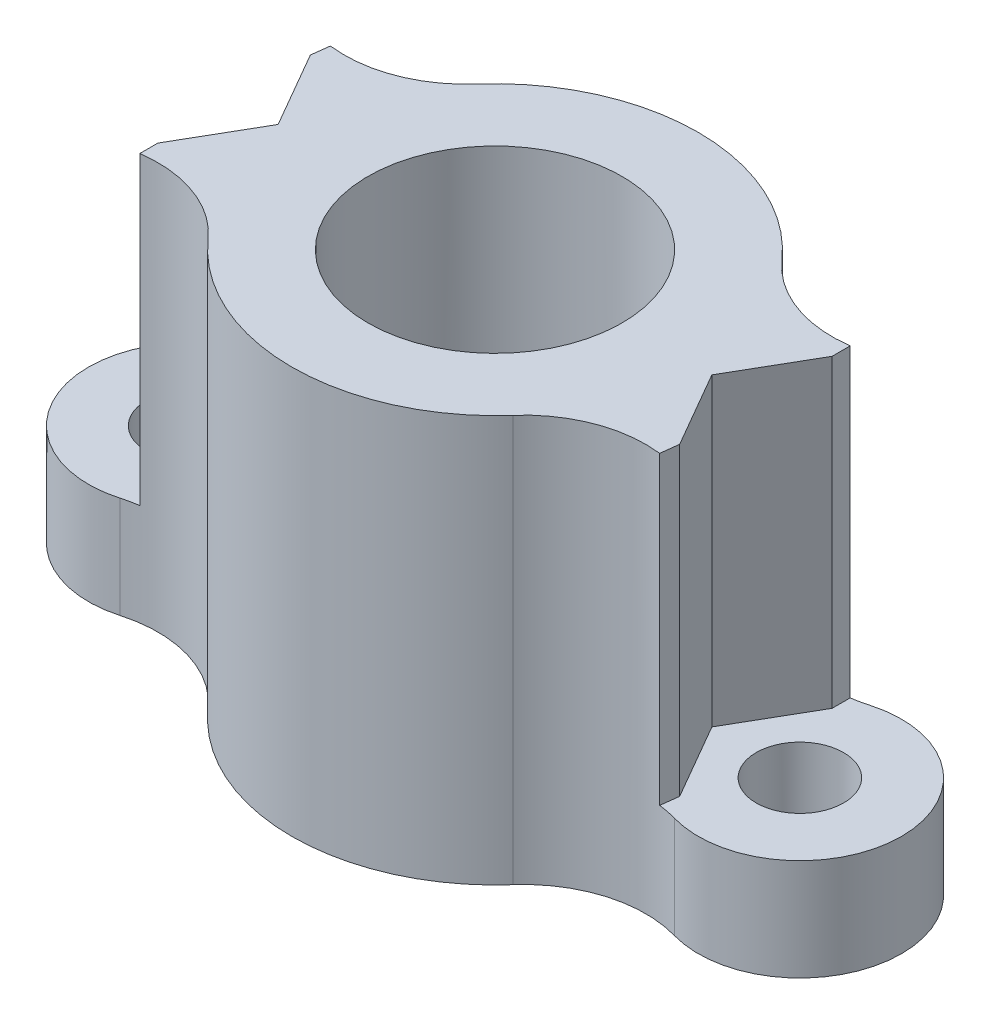
ISO-10303-21;
HEADER;
FILE_DESCRIPTION(('STEP AP214'),'2;1');
FILE_NAME('part.step','',(''),(''),'','','');
FILE_SCHEMA(('AUTOMOTIVE_DESIGN { 1 0 10303 214 1 1 1 1 }'));
ENDSEC;
DATA;
#1=APPLICATION_CONTEXT('core data for automotive mechanical design processes');
#2=APPLICATION_PROTOCOL_DEFINITION('international standard','automotive_design',2000,#1);
#3=PRODUCT_CONTEXT('',#1,'mechanical');
#4=PRODUCT('Part','Part','',(#3));
#5=PRODUCT_RELATED_PRODUCT_CATEGORY('part','',(#4));
#6=PRODUCT_DEFINITION_FORMATION('','',#4);
#7=PRODUCT_DEFINITION_CONTEXT('part definition',#1,'design');
#8=PRODUCT_DEFINITION('design','',#6,#7);
#9=PRODUCT_DEFINITION_SHAPE('','',#8);
#10=(LENGTH_UNIT() NAMED_UNIT(*) SI_UNIT(.MILLI.,.METRE.));
#11=(NAMED_UNIT(*) PLANE_ANGLE_UNIT() SI_UNIT($,.RADIAN.));
#12=(NAMED_UNIT(*) SI_UNIT($,.STERADIAN.) SOLID_ANGLE_UNIT());
#13=UNCERTAINTY_MEASURE_WITH_UNIT(LENGTH_MEASURE(1.E-05),#10,'distance_accuracy_value','');
#14=(GEOMETRIC_REPRESENTATION_CONTEXT(3) GLOBAL_UNCERTAINTY_ASSIGNED_CONTEXT((#13)) GLOBAL_UNIT_ASSIGNED_CONTEXT((#10,
#11,#12)) REPRESENTATION_CONTEXT('',''));
#15=CARTESIAN_POINT('',(0.,0.,0.));
#16=DIRECTION('',(0.,0.,1.));
#17=DIRECTION('',(1.,0.,0.));
#18=AXIS2_PLACEMENT_3D('',#15,#16,#17);
#19=CARTESIAN_POINT('',(0.,0.,0.));
#20=DIRECTION('',(0.,1.,0.));
#21=DIRECTION('',(0.,0.,1.));
#22=AXIS2_PLACEMENT_3D('',#19,#20,#21);
#23=CYLINDRICAL_SURFACE('',#22,2.25);
#24=CARTESIAN_POINT('',(0.,9.,0.));
#25=DIRECTION('',(0.,1.,0.));
#26=DIRECTION('',(0.,0.,1.));
#27=AXIS2_PLACEMENT_3D('',#24,#25,#26);
#28=CIRCLE('',#27,2.25);
#29=CARTESIAN_POINT('',(0.,9.,2.25));
#30=VERTEX_POINT('',#29);
#31=EDGE_CURVE('E209',#30,#30,#28,.T.);
#32=ORIENTED_EDGE('',*,*,#31,.T.);
#33=EDGE_LOOP('',(#32));
#34=FACE_BOUND('',#33,.T.);
#35=CARTESIAN_POINT('',(0.,4.,0.));
#36=DIRECTION('',(0.,-1.,0.));
#37=DIRECTION('',(0.,0.,-1.));
#38=AXIS2_PLACEMENT_3D('',#35,#36,#37);
#39=CIRCLE('',#38,2.25);
#40=CARTESIAN_POINT('',(0.,4.,-2.25));
#41=VERTEX_POINT('',#40);
#42=EDGE_CURVE('E45',#41,#41,#39,.F.);
#43=ORIENTED_EDGE('',*,*,#42,.F.);
#44=EDGE_LOOP('',(#43));
#45=FACE_BOUND('',#44,.T.);
#46=ADVANCED_FACE('F41',(#34,#45),#23,.F.);
#47=CARTESIAN_POINT('',(-12.,20.,10.5830052442584));
#48=DIRECTION('',(0.,-1.,0.));
#49=DIRECTION('',(0.,0.,-1.));
#50=AXIS2_PLACEMENT_3D('',#47,#48,#49);
#51=CYLINDRICAL_SURFACE('',#50,6.);
#52=DIRECTION('',(0.,1.,0.));
#53=VECTOR('',#52,1.);
#54=CARTESIAN_POINT('',(-12.8349364905389,-13.6766688264804,4.64138248134531));
#55=LINE('',#54,#53);
#56=CARTESIAN_POINT('',(-12.8349364905389,5.,4.64138248134531));
#57=VERTEX_POINT('',#56);
#58=CARTESIAN_POINT('',(-12.8349364905389,20.,4.64138248134531));
#59=VERTEX_POINT('',#58);
#60=EDGE_CURVE('E66',#57,#59,#55,.T.);
#61=ORIENTED_EDGE('',*,*,#60,.F.);
#62=CARTESIAN_POINT('',(-12.,5.,10.5830052442584));
#63=DIRECTION('',(0.,-1.,0.));
#64=DIRECTION('',(0.,0.,-1.));
#65=AXIS2_PLACEMENT_3D('',#62,#63,#64);
#66=CIRCLE('',#65,6.);
#67=CARTESIAN_POINT('',(-13.6363636363636,5.,4.81045692920835));
#68=VERTEX_POINT('',#67);
#69=EDGE_CURVE('E187',#68,#57,#66,.T.);
#70=ORIENTED_EDGE('',*,*,#69,.F.);
#71=DIRECTION('',(0.,-1.,0.));
#72=VECTOR('',#71,1.);
#73=CARTESIAN_POINT('',(-13.6363636363636,20.,4.81045692920835));
#74=LINE('',#73,#72);
#75=CARTESIAN_POINT('',(-13.6363636363636,0.,4.81045692920835));
#76=VERTEX_POINT('',#75);
#77=EDGE_CURVE('E302',#68,#76,#74,.T.);
#78=ORIENTED_EDGE('',*,*,#77,.T.);
#79=CARTESIAN_POINT('',(-12.,0.,10.5830052442584));
#80=DIRECTION('',(0.,-1.,0.));
#81=DIRECTION('',(0.,0.,-1.));
#82=AXIS2_PLACEMENT_3D('',#79,#80,#81);
#83=CIRCLE('',#82,6.);
#84=CARTESIAN_POINT('',(-7.50000000000001,0.,6.61437827766147));
#85=VERTEX_POINT('',#84);
#86=EDGE_CURVE('E280',#76,#85,#83,.T.);
#87=ORIENTED_EDGE('',*,*,#86,.T.);
#88=DIRECTION('',(0.,-1.,0.));
#89=VECTOR('',#88,1.);
#90=CARTESIAN_POINT('',(-7.50000000000001,20.,6.61437827766147));
#91=LINE('',#90,#89);
#92=CARTESIAN_POINT('',(-7.50000000000001,20.,6.61437827766147));
#93=VERTEX_POINT('',#92);
#94=EDGE_CURVE('E12',#93,#85,#91,.T.);
#95=ORIENTED_EDGE('',*,*,#94,.F.);
#96=CARTESIAN_POINT('',(-12.,20.,10.5830052442584));
#97=DIRECTION('',(0.,-1.,0.));
#98=DIRECTION('',(0.,0.,-1.));
#99=AXIS2_PLACEMENT_3D('',#96,#97,#98);
#100=CIRCLE('',#99,6.);
#101=EDGE_CURVE('E281',#59,#93,#100,.T.);
#102=ORIENTED_EDGE('',*,*,#101,.F.);
#103=EDGE_LOOP('',(#61,#70,#78,#87,#95,#102));
#104=FACE_BOUND('',#103,.T.);
#105=ADVANCED_FACE('F43',(#104),#51,.F.);
#106=CARTESIAN_POINT('',(12.,20.,-10.5830052442584));
#107=DIRECTION('',(0.,-1.,0.));
#108=DIRECTION('',(0.,0.,-1.));
#109=AXIS2_PLACEMENT_3D('',#106,#107,#108);
#110=CYLINDRICAL_SURFACE('',#109,6.);
#111=DIRECTION('',(0.,1.,0.));
#112=VECTOR('',#111,1.);
#113=CARTESIAN_POINT('',(12.8349364905389,-13.6766688264804,-4.64138248134531));
#114=LINE('',#113,#112);
#115=CARTESIAN_POINT('',(12.8349364905389,5.,-4.64138248134531));
#116=VERTEX_POINT('',#115);
#117=CARTESIAN_POINT('',(12.8349364905389,20.,-4.64138248134531));
#118=VERTEX_POINT('',#117);
#119=EDGE_CURVE('E58',#116,#118,#114,.T.);
#120=ORIENTED_EDGE('',*,*,#119,.F.);
#121=CARTESIAN_POINT('',(12.,5.,-10.5830052442584));
#122=DIRECTION('',(0.,-1.,0.));
#123=DIRECTION('',(0.,0.,-1.));
#124=AXIS2_PLACEMENT_3D('',#121,#122,#123);
#125=CIRCLE('',#124,6.);
#126=CARTESIAN_POINT('',(13.6363636363636,5.,-4.81045692920834));
#127=VERTEX_POINT('',#126);
#128=EDGE_CURVE('E219',#127,#116,#125,.T.);
#129=ORIENTED_EDGE('',*,*,#128,.F.);
#130=DIRECTION('',(0.,-1.,0.));
#131=VECTOR('',#130,1.);
#132=CARTESIAN_POINT('',(13.6363636363636,20.,-4.81045692920834));
#133=LINE('',#132,#131);
#134=CARTESIAN_POINT('',(13.6363636363636,0.,-4.81045692920834));
#135=VERTEX_POINT('',#134);
#136=EDGE_CURVE('E343',#127,#135,#133,.T.);
#137=ORIENTED_EDGE('',*,*,#136,.T.);
#138=CARTESIAN_POINT('',(12.,0.,-10.5830052442584));
#139=DIRECTION('',(0.,-1.,0.));
#140=DIRECTION('',(0.,0.,-1.));
#141=AXIS2_PLACEMENT_3D('',#138,#139,#140);
#142=CIRCLE('',#141,6.);
#143=CARTESIAN_POINT('',(7.5,0.,-6.61437827766147));
#144=VERTEX_POINT('',#143);
#145=EDGE_CURVE('E317',#135,#144,#142,.T.);
#146=ORIENTED_EDGE('',*,*,#145,.T.);
#147=DIRECTION('',(0.,-1.,0.));
#148=VECTOR('',#147,1.);
#149=CARTESIAN_POINT('',(7.5,20.,-6.61437827766147));
#150=LINE('',#149,#148);
#151=CARTESIAN_POINT('',(7.5,20.,-6.61437827766147));
#152=VERTEX_POINT('',#151);
#153=EDGE_CURVE('E339',#152,#144,#150,.T.);
#154=ORIENTED_EDGE('',*,*,#153,.F.);
#155=CARTESIAN_POINT('',(12.,20.,-10.5830052442584));
#156=DIRECTION('',(0.,-1.,0.));
#157=DIRECTION('',(0.,0.,-1.));
#158=AXIS2_PLACEMENT_3D('',#155,#156,#157);
#159=CIRCLE('',#158,6.);
#160=EDGE_CURVE('E292',#118,#152,#159,.T.);
#161=ORIENTED_EDGE('',*,*,#160,.F.);
#162=EDGE_LOOP('',(#120,#129,#137,#146,#154,#161));
#163=FACE_BOUND('',#162,.T.);
#164=ADVANCED_FACE('F409',(#163),#110,.F.);
#165=CARTESIAN_POINT('',(0.,20.,0.));
#166=DIRECTION('',(0.,-1.,0.));
#167=DIRECTION('',(0.,0.,-1.));
#168=AXIS2_PLACEMENT_3D('',#165,#166,#167);
#169=CYLINDRICAL_SURFACE('',#168,10.);
#170=CARTESIAN_POINT('',(0.,0.,0.));
#171=DIRECTION('',(0.,1.,0.));
#172=DIRECTION('',(0.,0.,1.));
#173=AXIS2_PLACEMENT_3D('',#170,#171,#172);
#174=CIRCLE('',#173,10.);
#175=CARTESIAN_POINT('',(7.5,0.,6.61437827766147));
#176=VERTEX_POINT('',#175);
#177=EDGE_CURVE('E306',#85,#176,#174,.T.);
#178=ORIENTED_EDGE('',*,*,#177,.T.);
#179=DIRECTION('',(0.,-1.,0.));
#180=VECTOR('',#179,1.);
#181=CARTESIAN_POINT('',(7.5,20.,6.61437827766147));
#182=LINE('',#181,#180);
#183=CARTESIAN_POINT('',(7.5,20.,6.61437827766147));
#184=VERTEX_POINT('',#183);
#185=EDGE_CURVE('E51',#184,#176,#182,.T.);
#186=ORIENTED_EDGE('',*,*,#185,.F.);
#187=CARTESIAN_POINT('',(0.,20.,0.));
#188=DIRECTION('',(0.,1.,0.));
#189=DIRECTION('',(0.,0.,1.));
#190=AXIS2_PLACEMENT_3D('',#187,#188,#189);
#191=CIRCLE('',#190,10.);
#192=EDGE_CURVE('E284',#93,#184,#191,.T.);
#193=ORIENTED_EDGE('',*,*,#192,.F.);
#194=ORIENTED_EDGE('',*,*,#94,.T.);
#195=EDGE_LOOP('',(#178,#186,#193,#194));
#196=FACE_BOUND('',#195,.T.);
#197=ADVANCED_FACE('F387',(#196),#169,.T.);
#198=CARTESIAN_POINT('',(12.,20.,10.5830052442584));
#199=DIRECTION('',(0.,-1.,0.));
#200=DIRECTION('',(0.,0.,-1.));
#201=AXIS2_PLACEMENT_3D('',#198,#199,#200);
#202=CYLINDRICAL_SURFACE('',#201,6.);
#203=CARTESIAN_POINT('',(12.,5.,10.5830052442584));
#204=DIRECTION('',(0.,-1.,0.));
#205=DIRECTION('',(0.,0.,-1.));
#206=AXIS2_PLACEMENT_3D('',#203,#204,#205);
#207=CIRCLE('',#206,6.);
#208=CARTESIAN_POINT('',(12.727737442472,5.,4.62730224504623));
#209=VERTEX_POINT('',#208);
#210=CARTESIAN_POINT('',(13.6363636363636,5.,4.81045692920834));
#211=VERTEX_POINT('',#210);
#212=EDGE_CURVE('E213',#209,#211,#207,.T.);
#213=ORIENTED_EDGE('',*,*,#212,.F.);
#214=DIRECTION('',(0.,1.,0.));
#215=VECTOR('',#214,1.);
#216=CARTESIAN_POINT('',(12.727737442472,-13.6766688264804,4.62730224504623));
#217=LINE('',#216,#215);
#218=CARTESIAN_POINT('',(12.727737442472,20.,4.62730224504623));
#219=VERTEX_POINT('',#218);
#220=EDGE_CURVE('E249',#209,#219,#217,.T.);
#221=ORIENTED_EDGE('',*,*,#220,.T.);
#222=CARTESIAN_POINT('',(12.,20.,10.5830052442584));
#223=DIRECTION('',(0.,-1.,0.));
#224=DIRECTION('',(0.,0.,1.));
#225=AXIS2_PLACEMENT_3D('',#222,#223,#224);
#226=CIRCLE('',#225,6.);
#227=EDGE_CURVE('E288',#184,#219,#226,.T.);
#228=ORIENTED_EDGE('',*,*,#227,.F.);
#229=ORIENTED_EDGE('',*,*,#185,.T.);
#230=CARTESIAN_POINT('',(12.,0.,10.5830052442584));
#231=DIRECTION('',(0.,-1.,0.));
#232=DIRECTION('',(0.,0.,1.));
#233=AXIS2_PLACEMENT_3D('',#230,#231,#232);
#234=CIRCLE('',#233,6.);
#235=CARTESIAN_POINT('',(13.6363636363636,0.,4.81045692920834));
#236=VERTEX_POINT('',#235);
#237=EDGE_CURVE('E309',#176,#236,#234,.T.);
#238=ORIENTED_EDGE('',*,*,#237,.T.);
#239=DIRECTION('',(0.,-1.,0.));
#240=VECTOR('',#239,1.);
#241=CARTESIAN_POINT('',(13.6363636363636,20.,4.81045692920834));
#242=LINE('',#241,#240);
#243=EDGE_CURVE('E346',#211,#236,#242,.T.);
#244=ORIENTED_EDGE('',*,*,#243,.F.);
#245=EDGE_LOOP('',(#213,#221,#228,#229,#238,#244));
#246=FACE_BOUND('',#245,.T.);
#247=ADVANCED_FACE('F356',(#246),#202,.F.);
#248=CARTESIAN_POINT('',(15.,20.,0.));
#249=DIRECTION('',(0.,-1.,0.));
#250=DIRECTION('',(0.,0.,-1.));
#251=AXIS2_PLACEMENT_3D('',#248,#249,#250);
#252=CYLINDRICAL_SURFACE('',#251,5.);
#253=ORIENTED_EDGE('',*,*,#136,.F.);
#254=CARTESIAN_POINT('',(15.,5.,0.));
#255=DIRECTION('',(0.,-1.,0.));
#256=DIRECTION('',(0.,0.,-1.));
#257=AXIS2_PLACEMENT_3D('',#254,#255,#256);
#258=CIRCLE('',#257,5.);
#259=EDGE_CURVE('E216',#211,#127,#258,.F.);
#260=ORIENTED_EDGE('',*,*,#259,.F.);
#261=ORIENTED_EDGE('',*,*,#243,.T.);
#262=CARTESIAN_POINT('',(15.,0.,0.));
#263=DIRECTION('',(0.,1.,0.));
#264=DIRECTION('',(0.,0.,1.));
#265=AXIS2_PLACEMENT_3D('',#262,#263,#264);
#266=CIRCLE('',#265,5.);
#267=EDGE_CURVE('E313',#236,#135,#266,.T.);
#268=ORIENTED_EDGE('',*,*,#267,.T.);
#269=EDGE_LOOP('',(#253,#260,#261,#268));
#270=FACE_BOUND('',#269,.T.);
#271=ADVANCED_FACE('F368',(#270),#252,.T.);
#272=CARTESIAN_POINT('',(0.,20.,0.));
#273=DIRECTION('',(0.,-1.,0.));
#274=DIRECTION('',(0.,0.,-1.));
#275=AXIS2_PLACEMENT_3D('',#272,#273,#274);
#276=CYLINDRICAL_SURFACE('',#275,10.);
#277=CARTESIAN_POINT('',(0.,0.,0.));
#278=DIRECTION('',(0.,1.,0.));
#279=DIRECTION('',(0.,0.,1.));
#280=AXIS2_PLACEMENT_3D('',#277,#278,#279);
#281=CIRCLE('',#280,10.);
#282=CARTESIAN_POINT('',(-7.5,0.,-6.61437827766148));
#283=VERTEX_POINT('',#282);
#284=EDGE_CURVE('E320',#144,#283,#281,.T.);
#285=ORIENTED_EDGE('',*,*,#284,.T.);
#286=DIRECTION('',(0.,-1.,0.));
#287=VECTOR('',#286,1.);
#288=CARTESIAN_POINT('',(-7.5,20.,-6.61437827766148));
#289=LINE('',#288,#287);
#290=CARTESIAN_POINT('',(-7.5,20.,-6.61437827766148));
#291=VERTEX_POINT('',#290);
#292=EDGE_CURVE('E335',#291,#283,#289,.T.);
#293=ORIENTED_EDGE('',*,*,#292,.F.);
#294=CARTESIAN_POINT('',(0.,20.,0.));
#295=DIRECTION('',(0.,1.,0.));
#296=DIRECTION('',(0.,0.,1.));
#297=AXIS2_PLACEMENT_3D('',#294,#295,#296);
#298=CIRCLE('',#297,10.);
#299=EDGE_CURVE('E295',#152,#291,#298,.T.);
#300=ORIENTED_EDGE('',*,*,#299,.F.);
#301=ORIENTED_EDGE('',*,*,#153,.T.);
#302=EDGE_LOOP('',(#285,#293,#300,#301));
#303=FACE_BOUND('',#302,.T.);
#304=ADVANCED_FACE('F405',(#303),#276,.T.);
#305=CARTESIAN_POINT('',(-12.,20.,-10.5830052442584));
#306=DIRECTION('',(0.,-1.,0.));
#307=DIRECTION('',(0.,0.,-1.));
#308=AXIS2_PLACEMENT_3D('',#305,#306,#307);
#309=CYLINDRICAL_SURFACE('',#308,6.);
#310=CARTESIAN_POINT('',(-12.,5.,-10.5830052442584));
#311=DIRECTION('',(0.,-1.,0.));
#312=DIRECTION('',(0.,0.,-1.));
#313=AXIS2_PLACEMENT_3D('',#310,#311,#312);
#314=CIRCLE('',#313,6.);
#315=CARTESIAN_POINT('',(-12.727737442472,5.,-4.62730224504623));
#316=VERTEX_POINT('',#315);
#317=CARTESIAN_POINT('',(-13.6363636363636,5.,-4.81045692920835));
#318=VERTEX_POINT('',#317);
#319=EDGE_CURVE('E423',#316,#318,#314,.T.);
#320=ORIENTED_EDGE('',*,*,#319,.F.);
#321=DIRECTION('',(0.,1.,0.));
#322=VECTOR('',#321,1.);
#323=CARTESIAN_POINT('',(-12.727737442472,-13.6766688264804,-4.62730224504623));
#324=LINE('',#323,#322);
#325=CARTESIAN_POINT('',(-12.727737442472,20.,-4.62730224504623));
#326=VERTEX_POINT('',#325);
#327=EDGE_CURVE('E420',#316,#326,#324,.T.);
#328=ORIENTED_EDGE('',*,*,#327,.T.);
#329=CARTESIAN_POINT('',(-12.,20.,-10.5830052442584));
#330=DIRECTION('',(0.,-1.,0.));
#331=DIRECTION('',(0.,0.,1.));
#332=AXIS2_PLACEMENT_3D('',#329,#330,#331);
#333=CIRCLE('',#332,6.);
#334=EDGE_CURVE('E298',#291,#326,#333,.T.);
#335=ORIENTED_EDGE('',*,*,#334,.F.);
#336=ORIENTED_EDGE('',*,*,#292,.T.);
#337=CARTESIAN_POINT('',(-12.,0.,-10.5830052442584));
#338=DIRECTION('',(0.,-1.,0.));
#339=DIRECTION('',(0.,0.,1.));
#340=AXIS2_PLACEMENT_3D('',#337,#338,#339);
#341=CIRCLE('',#340,6.);
#342=CARTESIAN_POINT('',(-13.6363636363636,0.,-4.81045692920835));
#343=VERTEX_POINT('',#342);
#344=EDGE_CURVE('E323',#283,#343,#341,.T.);
#345=ORIENTED_EDGE('',*,*,#344,.T.);
#346=DIRECTION('',(0.,-1.,0.));
#347=VECTOR('',#346,1.);
#348=CARTESIAN_POINT('',(-13.6363636363636,20.,-4.81045692920835));
#349=LINE('',#348,#347);
#350=EDGE_CURVE('E332',#318,#343,#349,.T.);
#351=ORIENTED_EDGE('',*,*,#350,.F.);
#352=EDGE_LOOP('',(#320,#328,#335,#336,#345,#351));
#353=FACE_BOUND('',#352,.T.);
#354=ADVANCED_FACE('F399',(#353),#309,.F.);
#355=CARTESIAN_POINT('',(-15.,20.,0.));
#356=DIRECTION('',(0.,-1.,0.));
#357=DIRECTION('',(0.,0.,-1.));
#358=AXIS2_PLACEMENT_3D('',#355,#356,#357);
#359=CYLINDRICAL_SURFACE('',#358,5.);
#360=ORIENTED_EDGE('',*,*,#77,.F.);
#361=CARTESIAN_POINT('',(-15.,5.,0.));
#362=DIRECTION('',(0.,-1.,0.));
#363=DIRECTION('',(0.,0.,-1.));
#364=AXIS2_PLACEMENT_3D('',#361,#362,#363);
#365=CIRCLE('',#364,5.);
#366=EDGE_CURVE('E396',#318,#68,#365,.F.);
#367=ORIENTED_EDGE('',*,*,#366,.F.);
#368=ORIENTED_EDGE('',*,*,#350,.T.);
#369=CARTESIAN_POINT('',(-15.,0.,0.));
#370=DIRECTION('',(0.,1.,0.));
#371=DIRECTION('',(0.,0.,1.));
#372=AXIS2_PLACEMENT_3D('',#369,#370,#371);
#373=CIRCLE('',#372,5.);
#374=EDGE_CURVE('E285',#343,#76,#373,.T.);
#375=ORIENTED_EDGE('',*,*,#374,.T.);
#376=EDGE_LOOP('',(#360,#367,#368,#375));
#377=FACE_BOUND('',#376,.T.);
#378=ADVANCED_FACE('F393',(#377),#359,.T.);
#379=CARTESIAN_POINT('',(-6.,20.,5.29150262212918));
#380=DIRECTION('',(0.,-1.,0.));
#381=DIRECTION('',(0.,0.,-1.));
#382=AXIS2_PLACEMENT_3D('',#379,#380,#381);
#383=PLANE('',#382);
#384=CARTESIAN_POINT('',(0.,20.,0.));
#385=DIRECTION('',(0.,1.,0.));
#386=DIRECTION('',(0.,0.,1.));
#387=AXIS2_PLACEMENT_3D('',#384,#385,#386);
#388=CIRCLE('',#387,6.25);
#389=CARTESIAN_POINT('',(0.,20.,6.25));
#390=VERTEX_POINT('',#389);
#391=EDGE_CURVE('E268',#390,#390,#388,.T.);
#392=ORIENTED_EDGE('',*,*,#391,.F.);
#393=EDGE_LOOP('',(#392));
#394=FACE_BOUND('',#393,.T.);
#395=ORIENTED_EDGE('',*,*,#334,.T.);
#396=DIRECTION('',(0.121289573745329,0.,-0.992617166535355));
#397=VECTOR('',#396,1.);
#398=CARTESIAN_POINT('',(-13.0975976010911,20.,-1.6004176470865));
#399=LINE('',#398,#397);
#400=CARTESIAN_POINT('',(-12.8349364905389,20.,-3.75));
#401=VERTEX_POINT('',#400);
#402=EDGE_CURVE('E194',#401,#326,#399,.T.);
#403=ORIENTED_EDGE('',*,*,#402,.F.);
#404=DIRECTION('',(-0.5,0.,-0.866025403784438));
#405=VECTOR('',#404,1.);
#406=CARTESIAN_POINT('',(-8.00240473580835,20.,4.62019052838329));
#407=LINE('',#406,#405);
#408=CARTESIAN_POINT('',(-10.6698729810778,20.,0.));
#409=VERTEX_POINT('',#408);
#410=EDGE_CURVE('E200',#409,#401,#407,.T.);
#411=ORIENTED_EDGE('',*,*,#410,.F.);
#412=DIRECTION('',(0.5,0.,-0.866025403784439));
#413=VECTOR('',#412,1.);
#414=CARTESIAN_POINT('',(-8.00240473580835,20.,-4.62019052838329));
#415=LINE('',#414,#413);
#416=CARTESIAN_POINT('',(-12.8349364905389,20.,3.75));
#417=VERTEX_POINT('',#416);
#418=EDGE_CURVE('E432',#417,#409,#415,.T.);
#419=ORIENTED_EDGE('',*,*,#418,.F.);
#420=DIRECTION('',(0.,0.,1.));
#421=VECTOR('',#420,1.);
#422=CARTESIAN_POINT('',(-12.8349364905389,20.,0.));
#423=LINE('',#422,#421);
#424=EDGE_CURVE('E189',#417,#59,#423,.T.);
#425=ORIENTED_EDGE('',*,*,#424,.T.);
#426=ORIENTED_EDGE('',*,*,#101,.T.);
#427=ORIENTED_EDGE('',*,*,#192,.T.);
#428=ORIENTED_EDGE('',*,*,#227,.T.);
#429=DIRECTION('',(-0.121289573745328,0.,0.992617166535355));
#430=VECTOR('',#429,1.);
#431=CARTESIAN_POINT('',(13.0975976010911,20.,1.60041764708649));
#432=LINE('',#431,#430);
#433=CARTESIAN_POINT('',(12.8349364905389,20.,3.75000000000001));
#434=VERTEX_POINT('',#433);
#435=EDGE_CURVE('E243',#434,#219,#432,.T.);
#436=ORIENTED_EDGE('',*,*,#435,.F.);
#437=DIRECTION('',(0.5,0.,0.866025403784439));
#438=VECTOR('',#437,1.);
#439=CARTESIAN_POINT('',(8.00240473580835,20.,-4.62019052838329));
#440=LINE('',#439,#438);
#441=CARTESIAN_POINT('',(10.6698729810778,20.,0.));
#442=VERTEX_POINT('',#441);
#443=EDGE_CURVE('E239',#442,#434,#440,.T.);
#444=ORIENTED_EDGE('',*,*,#443,.F.);
#445=DIRECTION('',(-0.5,0.,0.866025403784439));
#446=VECTOR('',#445,1.);
#447=CARTESIAN_POINT('',(8.00240473580835,20.,4.62019052838329));
#448=LINE('',#447,#446);
#449=CARTESIAN_POINT('',(12.8349364905389,20.,-3.75000000000001));
#450=VERTEX_POINT('',#449);
#451=EDGE_CURVE('E235',#450,#442,#448,.T.);
#452=ORIENTED_EDGE('',*,*,#451,.F.);
#453=DIRECTION('',(0.,0.,-1.));
#454=VECTOR('',#453,1.);
#455=CARTESIAN_POINT('',(12.8349364905389,20.,0.));
#456=LINE('',#455,#454);
#457=EDGE_CURVE('E226',#450,#118,#456,.T.);
#458=ORIENTED_EDGE('',*,*,#457,.T.);
#459=ORIENTED_EDGE('',*,*,#160,.T.);
#460=ORIENTED_EDGE('',*,*,#299,.T.);
#461=EDGE_LOOP('',(#395,#403,#411,#419,#425,#426,#427,#428,#436,#444,#452,#458,#459,#460));
#462=FACE_BOUND('',#461,.T.);
#463=ADVANCED_FACE('F384',(#394,#462),#383,.F.);
#464=CARTESIAN_POINT('',(-6.,0.,5.29150262212918));
#465=DIRECTION('',(0.,-1.,0.));
#466=DIRECTION('',(0.,0.,-1.));
#467=AXIS2_PLACEMENT_3D('',#464,#465,#466);
#468=PLANE('',#467);
#469=CARTESIAN_POINT('',(0.,0.,0.));
#470=DIRECTION('',(0.,-1.,0.));
#471=DIRECTION('',(0.,0.,-1.));
#472=AXIS2_PLACEMENT_3D('',#469,#470,#471);
#473=CIRCLE('',#472,4.);
#474=CARTESIAN_POINT('',(0.,0.,-4.));
#475=VERTEX_POINT('',#474);
#476=EDGE_CURVE('E458',#475,#475,#473,.T.);
#477=ORIENTED_EDGE('',*,*,#476,.F.);
#478=EDGE_LOOP('',(#477));
#479=FACE_BOUND('',#478,.T.);
#480=CARTESIAN_POINT('',(-15.,0.,0.));
#481=DIRECTION('',(0.,1.,0.));
#482=DIRECTION('',(0.,0.,1.));
#483=AXIS2_PLACEMENT_3D('',#480,#481,#482);
#484=CIRCLE('',#483,2.15);
#485=CARTESIAN_POINT('',(-15.,0.,2.15));
#486=VERTEX_POINT('',#485);
#487=EDGE_CURVE('E264',#486,#486,#484,.T.);
#488=ORIENTED_EDGE('',*,*,#487,.T.);
#489=EDGE_LOOP('',(#488));
#490=FACE_BOUND('',#489,.T.);
#491=CARTESIAN_POINT('',(15.,0.,0.));
#492=DIRECTION('',(0.,1.,0.));
#493=DIRECTION('',(0.,0.,1.));
#494=AXIS2_PLACEMENT_3D('',#491,#492,#493);
#495=CIRCLE('',#494,2.15);
#496=CARTESIAN_POINT('',(15.,0.,2.15));
#497=VERTEX_POINT('',#496);
#498=EDGE_CURVE('E269',#497,#497,#495,.T.);
#499=ORIENTED_EDGE('',*,*,#498,.T.);
#500=EDGE_LOOP('',(#499));
#501=FACE_BOUND('',#500,.T.);
#502=ORIENTED_EDGE('',*,*,#86,.F.);
#503=ORIENTED_EDGE('',*,*,#374,.F.);
#504=ORIENTED_EDGE('',*,*,#344,.F.);
#505=ORIENTED_EDGE('',*,*,#284,.F.);
#506=ORIENTED_EDGE('',*,*,#145,.F.);
#507=ORIENTED_EDGE('',*,*,#267,.F.);
#508=ORIENTED_EDGE('',*,*,#237,.F.);
#509=ORIENTED_EDGE('',*,*,#177,.F.);
#510=EDGE_LOOP('',(#502,#503,#504,#505,#506,#507,#508,#509));
#511=FACE_BOUND('',#510,.T.);
#512=ADVANCED_FACE('F363',(#479,#490,#501,#511),#468,.T.);
#513=CARTESIAN_POINT('',(-6.,9.,5.29150262212918));
#514=DIRECTION('',(0.,-1.,0.));
#515=DIRECTION('',(0.,0.,-1.));
#516=AXIS2_PLACEMENT_3D('',#513,#514,#515);
#517=PLANE('',#516);
#518=ORIENTED_EDGE('',*,*,#31,.F.);
#519=EDGE_LOOP('',(#518));
#520=FACE_BOUND('',#519,.T.);
#521=CARTESIAN_POINT('',(0.,9.,0.));
#522=DIRECTION('',(0.,-1.,0.));
#523=DIRECTION('',(0.,0.,-1.));
#524=AXIS2_PLACEMENT_3D('',#521,#522,#523);
#525=CIRCLE('',#524,6.25);
#526=CARTESIAN_POINT('',(0.,9.,-6.25));
#527=VERTEX_POINT('',#526);
#528=EDGE_CURVE('E276',#527,#527,#525,.F.);
#529=ORIENTED_EDGE('',*,*,#528,.T.);
#530=EDGE_LOOP('',(#529));
#531=FACE_BOUND('',#530,.T.);
#532=ADVANCED_FACE('F467',(#520,#531),#517,.F.);
#533=CARTESIAN_POINT('',(0.,-17.6776695296637,0.));
#534=DIRECTION('',(0.,1.,0.));
#535=DIRECTION('',(0.,0.,1.));
#536=AXIS2_PLACEMENT_3D('',#533,#534,#535);
#537=CYLINDRICAL_SURFACE('',#536,6.25);
#538=ORIENTED_EDGE('',*,*,#391,.T.);
#539=EDGE_LOOP('',(#538));
#540=FACE_BOUND('',#539,.T.);
#541=ORIENTED_EDGE('',*,*,#528,.F.);
#542=EDGE_LOOP('',(#541));
#543=FACE_BOUND('',#542,.T.);
#544=ADVANCED_FACE('F476',(#540,#543),#537,.F.);
#545=CARTESIAN_POINT('',(15.,0.,0.));
#546=DIRECTION('',(0.,1.,0.));
#547=DIRECTION('',(0.,0.,1.));
#548=AXIS2_PLACEMENT_3D('',#545,#546,#547);
#549=CYLINDRICAL_SURFACE('',#548,2.15);
#550=CARTESIAN_POINT('',(15.,5.,0.));
#551=DIRECTION('',(0.,-1.,0.));
#552=DIRECTION('',(0.,0.,-1.));
#553=AXIS2_PLACEMENT_3D('',#550,#551,#552);
#554=CIRCLE('',#553,2.15);
#555=CARTESIAN_POINT('',(15.,5.,-2.15));
#556=VERTEX_POINT('',#555);
#557=EDGE_CURVE('E227',#556,#556,#554,.F.);
#558=ORIENTED_EDGE('',*,*,#557,.T.);
#559=EDGE_LOOP('',(#558));
#560=FACE_BOUND('',#559,.T.);
#561=ORIENTED_EDGE('',*,*,#498,.F.);
#562=EDGE_LOOP('',(#561));
#563=FACE_BOUND('',#562,.T.);
#564=ADVANCED_FACE('F473',(#560,#563),#549,.F.);
#565=CARTESIAN_POINT('',(-15.,0.,0.));
#566=DIRECTION('',(0.,1.,0.));
#567=DIRECTION('',(0.,0.,1.));
#568=AXIS2_PLACEMENT_3D('',#565,#566,#567);
#569=CYLINDRICAL_SURFACE('',#568,2.15);
#570=CARTESIAN_POINT('',(-15.,5.,0.));
#571=DIRECTION('',(0.,-1.,0.));
#572=DIRECTION('',(0.,0.,-1.));
#573=AXIS2_PLACEMENT_3D('',#570,#571,#572);
#574=CIRCLE('',#573,2.15);
#575=CARTESIAN_POINT('',(-15.,5.,-2.15));
#576=VERTEX_POINT('',#575);
#577=EDGE_CURVE('E180',#576,#576,#574,.F.);
#578=ORIENTED_EDGE('',*,*,#577,.T.);
#579=EDGE_LOOP('',(#578));
#580=FACE_BOUND('',#579,.T.);
#581=ORIENTED_EDGE('',*,*,#487,.F.);
#582=EDGE_LOOP('',(#581));
#583=FACE_BOUND('',#582,.T.);
#584=ADVANCED_FACE('F475',(#580,#583),#569,.F.);
#585=CARTESIAN_POINT('',(-8.00240473580835,-13.6766688264804,-4.62019052838329));
#586=DIRECTION('',(0.866025403784438,0.,0.5));
#587=DIRECTION('',(0.5,0.,-0.866025403784439));
#588=AXIS2_PLACEMENT_3D('',#585,#586,#587);
#589=PLANE('',#588);
#590=DIRECTION('',(0.,1.,0.));
#591=VECTOR('',#590,1.);
#592=CARTESIAN_POINT('',(-12.8349364905389,-13.6766688264804,3.75));
#593=LINE('',#592,#591);
#594=CARTESIAN_POINT('',(-12.8349364905389,5.,3.75));
#595=VERTEX_POINT('',#594);
#596=EDGE_CURVE('E175',#595,#417,#593,.T.);
#597=ORIENTED_EDGE('',*,*,#596,.T.);
#598=ORIENTED_EDGE('',*,*,#418,.T.);
#599=DIRECTION('',(0.,1.,0.));
#600=VECTOR('',#599,1.);
#601=CARTESIAN_POINT('',(-10.6698729810778,-13.6766688264804,0.));
#602=LINE('',#601,#600);
#603=CARTESIAN_POINT('',(-10.6698729810778,5.,0.));
#604=VERTEX_POINT('',#603);
#605=EDGE_CURVE('E176',#604,#409,#602,.T.);
#606=ORIENTED_EDGE('',*,*,#605,.F.);
#607=DIRECTION('',(0.5,0.,-0.866025403784439));
#608=VECTOR('',#607,1.);
#609=CARTESIAN_POINT('',(-8.00240473580835,5.,-4.62019052838329));
#610=LINE('',#609,#608);
#611=EDGE_CURVE('E170',#595,#604,#610,.T.);
#612=ORIENTED_EDGE('',*,*,#611,.F.);
#613=EDGE_LOOP('',(#597,#598,#606,#612));
#614=FACE_BOUND('',#613,.T.);
#615=ADVANCED_FACE('F172',(#614),#589,.F.);
#616=CARTESIAN_POINT('',(-8.00240473580835,-13.6766688264804,4.62019052838329));
#617=DIRECTION('',(0.866025403784438,0.,-0.5));
#618=DIRECTION('',(-0.5,0.,-0.866025403784438));
#619=AXIS2_PLACEMENT_3D('',#616,#617,#618);
#620=PLANE('',#619);
#621=ORIENTED_EDGE('',*,*,#605,.T.);
#622=ORIENTED_EDGE('',*,*,#410,.T.);
#623=DIRECTION('',(0.,1.,0.));
#624=VECTOR('',#623,1.);
#625=CARTESIAN_POINT('',(-12.8349364905389,-13.6766688264804,-3.75));
#626=LINE('',#625,#624);
#627=CARTESIAN_POINT('',(-12.8349364905389,5.,-3.75));
#628=VERTEX_POINT('',#627);
#629=EDGE_CURVE('E198',#628,#401,#626,.T.);
#630=ORIENTED_EDGE('',*,*,#629,.F.);
#631=DIRECTION('',(-0.5,0.,-0.866025403784438));
#632=VECTOR('',#631,1.);
#633=CARTESIAN_POINT('',(-8.00240473580835,5.,4.62019052838329));
#634=LINE('',#633,#632);
#635=EDGE_CURVE('E231',#604,#628,#634,.T.);
#636=ORIENTED_EDGE('',*,*,#635,.F.);
#637=EDGE_LOOP('',(#621,#622,#630,#636));
#638=FACE_BOUND('',#637,.T.);
#639=ADVANCED_FACE('F501',(#638),#620,.F.);
#640=CARTESIAN_POINT('',(-13.0975976010911,-13.6766688264804,-1.6004176470865));
#641=DIRECTION('',(0.992617166535355,0.,0.121289573745329));
#642=DIRECTION('',(0.121289573745329,0.,-0.992617166535355));
#643=AXIS2_PLACEMENT_3D('',#640,#641,#642);
#644=PLANE('',#643);
#645=ORIENTED_EDGE('',*,*,#629,.T.);
#646=ORIENTED_EDGE('',*,*,#402,.T.);
#647=ORIENTED_EDGE('',*,*,#327,.F.);
#648=DIRECTION('',(0.121289573745329,0.,-0.992617166535355));
#649=VECTOR('',#648,1.);
#650=CARTESIAN_POINT('',(-13.0975976010911,5.,-1.6004176470865));
#651=LINE('',#650,#649);
#652=EDGE_CURVE('E446',#628,#316,#651,.T.);
#653=ORIENTED_EDGE('',*,*,#652,.F.);
#654=EDGE_LOOP('',(#645,#646,#647,#653));
#655=FACE_BOUND('',#654,.T.);
#656=ADVANCED_FACE('F419',(#655),#644,.F.);
#657=CARTESIAN_POINT('',(-12.8349364905389,-13.6766688264804,0.));
#658=DIRECTION('',(-1.,0.,0.));
#659=DIRECTION('',(0.,0.,1.));
#660=AXIS2_PLACEMENT_3D('',#657,#658,#659);
#661=PLANE('',#660);
#662=DIRECTION('',(0.,0.,1.));
#663=VECTOR('',#662,1.);
#664=CARTESIAN_POINT('',(-12.8349364905389,5.,0.));
#665=LINE('',#664,#663);
#666=EDGE_CURVE('E183',#595,#57,#665,.T.);
#667=ORIENTED_EDGE('',*,*,#666,.T.);
#668=ORIENTED_EDGE('',*,*,#60,.T.);
#669=ORIENTED_EDGE('',*,*,#424,.F.);
#670=ORIENTED_EDGE('',*,*,#596,.F.);
#671=EDGE_LOOP('',(#667,#668,#669,#670));
#672=FACE_BOUND('',#671,.T.);
#673=ADVANCED_FACE('F191',(#672),#661,.T.);
#674=CARTESIAN_POINT('',(-6.,5.,5.29150262212918));
#675=DIRECTION('',(0.,-1.,0.));
#676=DIRECTION('',(0.,0.,-1.));
#677=AXIS2_PLACEMENT_3D('',#674,#675,#676);
#678=PLANE('',#677);
#679=ORIENTED_EDGE('',*,*,#611,.T.);
#680=ORIENTED_EDGE('',*,*,#635,.T.);
#681=ORIENTED_EDGE('',*,*,#652,.T.);
#682=ORIENTED_EDGE('',*,*,#319,.T.);
#683=ORIENTED_EDGE('',*,*,#366,.T.);
#684=ORIENTED_EDGE('',*,*,#69,.T.);
#685=ORIENTED_EDGE('',*,*,#666,.F.);
#686=EDGE_LOOP('',(#679,#680,#681,#682,#683,#684,#685));
#687=FACE_BOUND('',#686,.T.);
#688=ORIENTED_EDGE('',*,*,#577,.F.);
#689=EDGE_LOOP('',(#688));
#690=FACE_BOUND('',#689,.T.);
#691=ADVANCED_FACE('F184',(#687,#690),#678,.F.);
#692=CARTESIAN_POINT('',(8.00240473580835,-13.6766688264804,4.62019052838329));
#693=DIRECTION('',(-0.866025403784438,0.,-0.5));
#694=DIRECTION('',(-0.5,0.,0.866025403784439));
#695=AXIS2_PLACEMENT_3D('',#692,#693,#694);
#696=PLANE('',#695);
#697=DIRECTION('',(0.,1.,0.));
#698=VECTOR('',#697,1.);
#699=CARTESIAN_POINT('',(12.8349364905389,-13.6766688264804,-3.75000000000001));
#700=LINE('',#699,#698);
#701=CARTESIAN_POINT('',(12.8349364905389,5.,-3.75000000000001));
#702=VERTEX_POINT('',#701);
#703=EDGE_CURVE('E246',#702,#450,#700,.T.);
#704=ORIENTED_EDGE('',*,*,#703,.T.);
#705=ORIENTED_EDGE('',*,*,#451,.T.);
#706=DIRECTION('',(0.,1.,0.));
#707=VECTOR('',#706,1.);
#708=CARTESIAN_POINT('',(10.6698729810778,-13.6766688264804,0.));
#709=LINE('',#708,#707);
#710=CARTESIAN_POINT('',(10.6698729810778,5.,0.));
#711=VERTEX_POINT('',#710);
#712=EDGE_CURVE('E256',#711,#442,#709,.T.);
#713=ORIENTED_EDGE('',*,*,#712,.F.);
#714=DIRECTION('',(-0.5,0.,0.866025403784439));
#715=VECTOR('',#714,1.);
#716=CARTESIAN_POINT('',(8.00240473580835,5.,4.62019052838329));
#717=LINE('',#716,#715);
#718=EDGE_CURVE('E232',#702,#711,#717,.T.);
#719=ORIENTED_EDGE('',*,*,#718,.F.);
#720=EDGE_LOOP('',(#704,#705,#713,#719));
#721=FACE_BOUND('',#720,.T.);
#722=ADVANCED_FACE('F414',(#721),#696,.F.);
#723=CARTESIAN_POINT('',(8.00240473580835,-13.6766688264804,-4.62019052838329));
#724=DIRECTION('',(-0.866025403784439,0.,0.5));
#725=DIRECTION('',(0.5,0.,0.866025403784439));
#726=AXIS2_PLACEMENT_3D('',#723,#724,#725);
#727=PLANE('',#726);
#728=ORIENTED_EDGE('',*,*,#712,.T.);
#729=ORIENTED_EDGE('',*,*,#443,.T.);
#730=DIRECTION('',(0.,1.,0.));
#731=VECTOR('',#730,1.);
#732=CARTESIAN_POINT('',(12.8349364905389,-13.6766688264804,3.75000000000001));
#733=LINE('',#732,#731);
#734=CARTESIAN_POINT('',(12.8349364905389,5.,3.75000000000001));
#735=VERTEX_POINT('',#734);
#736=EDGE_CURVE('E253',#735,#434,#733,.T.);
#737=ORIENTED_EDGE('',*,*,#736,.F.);
#738=DIRECTION('',(0.5,0.,0.866025403784439));
#739=VECTOR('',#738,1.);
#740=CARTESIAN_POINT('',(8.00240473580835,5.,-4.62019052838329));
#741=LINE('',#740,#739);
#742=EDGE_CURVE('E204',#711,#735,#741,.T.);
#743=ORIENTED_EDGE('',*,*,#742,.F.);
#744=EDGE_LOOP('',(#728,#729,#737,#743));
#745=FACE_BOUND('',#744,.T.);
#746=ADVANCED_FACE('F378',(#745),#727,.F.);
#747=CARTESIAN_POINT('',(13.0975976010911,-13.6766688264804,1.60041764708649));
#748=DIRECTION('',(-0.992617166535355,0.,-0.121289573745328));
#749=DIRECTION('',(-0.121289573745328,0.,0.992617166535355));
#750=AXIS2_PLACEMENT_3D('',#747,#748,#749);
#751=PLANE('',#750);
#752=ORIENTED_EDGE('',*,*,#736,.T.);
#753=ORIENTED_EDGE('',*,*,#435,.T.);
#754=ORIENTED_EDGE('',*,*,#220,.F.);
#755=DIRECTION('',(-0.121289573745328,0.,0.992617166535355));
#756=VECTOR('',#755,1.);
#757=CARTESIAN_POINT('',(13.0975976010911,5.,1.60041764708649));
#758=LINE('',#757,#756);
#759=EDGE_CURVE('E208',#735,#209,#758,.T.);
#760=ORIENTED_EDGE('',*,*,#759,.F.);
#761=EDGE_LOOP('',(#752,#753,#754,#760));
#762=FACE_BOUND('',#761,.T.);
#763=ADVANCED_FACE('F376',(#762),#751,.F.);
#764=CARTESIAN_POINT('',(12.8349364905389,-13.6766688264804,0.));
#765=DIRECTION('',(1.,0.,0.));
#766=DIRECTION('',(0.,0.,-1.));
#767=AXIS2_PLACEMENT_3D('',#764,#765,#766);
#768=PLANE('',#767);
#769=DIRECTION('',(0.,0.,-1.));
#770=VECTOR('',#769,1.);
#771=CARTESIAN_POINT('',(12.8349364905389,5.,0.));
#772=LINE('',#771,#770);
#773=EDGE_CURVE('E223',#702,#116,#772,.T.);
#774=ORIENTED_EDGE('',*,*,#773,.T.);
#775=ORIENTED_EDGE('',*,*,#119,.T.);
#776=ORIENTED_EDGE('',*,*,#457,.F.);
#777=ORIENTED_EDGE('',*,*,#703,.F.);
#778=EDGE_LOOP('',(#774,#775,#776,#777));
#779=FACE_BOUND('',#778,.T.);
#780=ADVANCED_FACE('F412',(#779),#768,.T.);
#781=CARTESIAN_POINT('',(-6.,5.,5.29150262212918));
#782=DIRECTION('',(0.,-1.,0.));
#783=DIRECTION('',(0.,0.,-1.));
#784=AXIS2_PLACEMENT_3D('',#781,#782,#783);
#785=PLANE('',#784);
#786=ORIENTED_EDGE('',*,*,#718,.T.);
#787=ORIENTED_EDGE('',*,*,#742,.T.);
#788=ORIENTED_EDGE('',*,*,#759,.T.);
#789=ORIENTED_EDGE('',*,*,#212,.T.);
#790=ORIENTED_EDGE('',*,*,#259,.T.);
#791=ORIENTED_EDGE('',*,*,#128,.T.);
#792=ORIENTED_EDGE('',*,*,#773,.F.);
#793=EDGE_LOOP('',(#786,#787,#788,#789,#790,#791,#792));
#794=FACE_BOUND('',#793,.T.);
#795=ORIENTED_EDGE('',*,*,#557,.F.);
#796=EDGE_LOOP('',(#795));
#797=FACE_BOUND('',#796,.T.);
#798=ADVANCED_FACE('F371',(#794,#797),#785,.F.);
#799=CARTESIAN_POINT('',(-6.,4.,5.29150262212918));
#800=DIRECTION('',(0.,-1.,0.));
#801=DIRECTION('',(0.,0.,-1.));
#802=AXIS2_PLACEMENT_3D('',#799,#800,#801);
#803=PLANE('',#802);
#804=CARTESIAN_POINT('',(0.,4.,0.));
#805=DIRECTION('',(0.,-1.,0.));
#806=DIRECTION('',(0.,0.,-1.));
#807=AXIS2_PLACEMENT_3D('',#804,#805,#806);
#808=CIRCLE('',#807,4.);
#809=CARTESIAN_POINT('',(0.,4.,-4.));
#810=VERTEX_POINT('',#809);
#811=EDGE_CURVE('E454',#810,#810,#808,.F.);
#812=ORIENTED_EDGE('',*,*,#811,.F.);
#813=EDGE_LOOP('',(#812));
#814=FACE_BOUND('',#813,.T.);
#815=ORIENTED_EDGE('',*,*,#42,.T.);
#816=EDGE_LOOP('',(#815));
#817=FACE_BOUND('',#816,.T.);
#818=ADVANCED_FACE('F511',(#814,#817),#803,.T.);
#819=CARTESIAN_POINT('',(0.,20.3137084989848,0.));
#820=DIRECTION('',(0.,-1.,0.));
#821=DIRECTION('',(0.,0.,-1.));
#822=AXIS2_PLACEMENT_3D('',#819,#820,#821);
#823=CYLINDRICAL_SURFACE('',#822,4.);
#824=ORIENTED_EDGE('',*,*,#811,.T.);
#825=EDGE_LOOP('',(#824));
#826=FACE_BOUND('',#825,.T.);
#827=ORIENTED_EDGE('',*,*,#476,.T.);
#828=EDGE_LOOP('',(#827));
#829=FACE_BOUND('',#828,.T.);
#830=ADVANCED_FACE('F463',(#826,#829),#823,.F.);
#831=CLOSED_SHELL('',(#46,#105,#164,#197,#247,#271,#304,#354,#378,#463,#512,#532,#544,#564,#584,
#615,#639,#656,#673,#691,#722,#746,#763,#780,#798,#818,#830));
#832=MANIFOLD_SOLID_BREP('B2',#831);
#833=ADVANCED_BREP_SHAPE_REPRESENTATION('',(#18,#832),#14);
#834=SHAPE_DEFINITION_REPRESENTATION(#9,#833);
ENDSEC;
END-ISO-10303-21;
